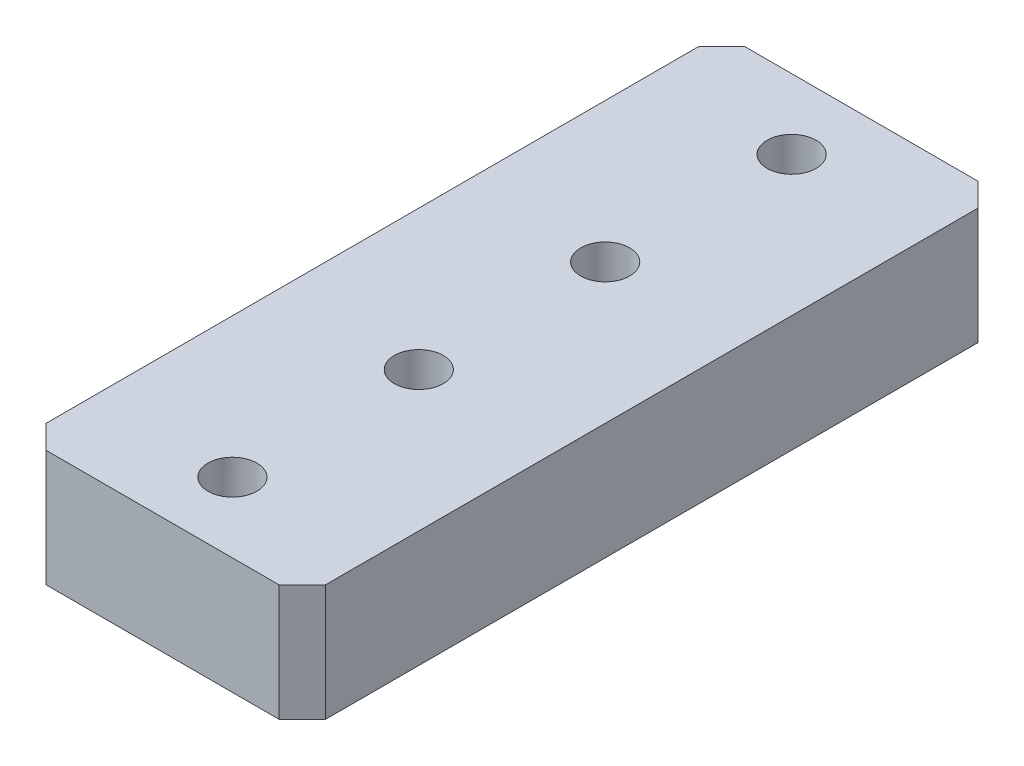
ISO-10303-21;
HEADER;
FILE_DESCRIPTION(('STEP AP214'),'2;1');
FILE_NAME('part.step','',(''),(''),'','','');
FILE_SCHEMA(('AUTOMOTIVE_DESIGN { 1 0 10303 214 1 1 1 1 }'));
ENDSEC;
DATA;
#1=APPLICATION_CONTEXT('core data for automotive mechanical design processes');
#2=APPLICATION_PROTOCOL_DEFINITION('international standard','automotive_design',2000,#1);
#3=PRODUCT_CONTEXT('',#1,'mechanical');
#4=PRODUCT('Part','Part','',(#3));
#5=PRODUCT_RELATED_PRODUCT_CATEGORY('part','',(#4));
#6=PRODUCT_DEFINITION_FORMATION('','',#4);
#7=PRODUCT_DEFINITION_CONTEXT('part definition',#1,'design');
#8=PRODUCT_DEFINITION('design','',#6,#7);
#9=PRODUCT_DEFINITION_SHAPE('','',#8);
#10=(LENGTH_UNIT() NAMED_UNIT(*) SI_UNIT(.MILLI.,.METRE.));
#11=(NAMED_UNIT(*) PLANE_ANGLE_UNIT() SI_UNIT($,.RADIAN.));
#12=(NAMED_UNIT(*) SI_UNIT($,.STERADIAN.) SOLID_ANGLE_UNIT());
#13=UNCERTAINTY_MEASURE_WITH_UNIT(LENGTH_MEASURE(1.E-05),#10,'distance_accuracy_value','');
#14=(GEOMETRIC_REPRESENTATION_CONTEXT(3) GLOBAL_UNCERTAINTY_ASSIGNED_CONTEXT((#13)) GLOBAL_UNIT_ASSIGNED_CONTEXT((#10,
#11,#12)) REPRESENTATION_CONTEXT('',''));
#15=CARTESIAN_POINT('',(0.,0.,0.));
#16=DIRECTION('',(0.,0.,1.));
#17=DIRECTION('',(1.,0.,0.));
#18=AXIS2_PLACEMENT_3D('',#15,#16,#17);
#19=CARTESIAN_POINT('',(0.,-5.,8.));
#20=DIRECTION('',(0.,1.,0.));
#21=DIRECTION('',(0.,0.,1.));
#22=AXIS2_PLACEMENT_3D('',#19,#20,#21);
#23=CYLINDRICAL_SURFACE('',#22,2.1);
#24=CARTESIAN_POINT('',(0.,10.,8.));
#25=DIRECTION('',(0.,1.,0.));
#26=DIRECTION('',(0.,0.,1.));
#27=AXIS2_PLACEMENT_3D('',#24,#25,#26);
#28=CIRCLE('',#27,2.1);
#29=CARTESIAN_POINT('',(0.,10.,10.1));
#30=VERTEX_POINT('',#29);
#31=EDGE_CURVE('E192',#30,#30,#28,.T.);
#32=ORIENTED_EDGE('',*,*,#31,.T.);
#33=EDGE_LOOP('',(#32));
#34=FACE_BOUND('',#33,.T.);
#35=CARTESIAN_POINT('',(0.,6.,8.));
#36=DIRECTION('',(0.,-1.,0.));
#37=DIRECTION('',(0.,0.,-1.));
#38=AXIS2_PLACEMENT_3D('',#35,#36,#37);
#39=CIRCLE('',#38,2.1);
#40=CARTESIAN_POINT('',(0.,6.,5.9));
#41=VERTEX_POINT('',#40);
#42=EDGE_CURVE('E48',#41,#41,#39,.F.);
#43=ORIENTED_EDGE('',*,*,#42,.F.);
#44=EDGE_LOOP('',(#43));
#45=FACE_BOUND('',#44,.T.);
#46=ADVANCED_FACE('F43',(#34,#45),#23,.F.);
#47=CARTESIAN_POINT('',(0.,-5.,-8.));
#48=DIRECTION('',(0.,1.,0.));
#49=DIRECTION('',(0.,0.,1.));
#50=AXIS2_PLACEMENT_3D('',#47,#48,#49);
#51=CYLINDRICAL_SURFACE('',#50,2.1);
#52=CARTESIAN_POINT('',(0.,10.,-8.));
#53=DIRECTION('',(0.,1.,0.));
#54=DIRECTION('',(0.,0.,1.));
#55=AXIS2_PLACEMENT_3D('',#52,#53,#54);
#56=CIRCLE('',#55,2.1);
#57=CARTESIAN_POINT('',(0.,10.,-5.9));
#58=VERTEX_POINT('',#57);
#59=EDGE_CURVE('E188',#58,#58,#56,.T.);
#60=ORIENTED_EDGE('',*,*,#59,.T.);
#61=EDGE_LOOP('',(#60));
#62=FACE_BOUND('',#61,.T.);
#63=CARTESIAN_POINT('',(0.,6.,-8.));
#64=DIRECTION('',(0.,-1.,0.));
#65=DIRECTION('',(0.,0.,-1.));
#66=AXIS2_PLACEMENT_3D('',#63,#64,#65);
#67=CIRCLE('',#66,2.1);
#68=CARTESIAN_POINT('',(0.,6.,-10.1));
#69=VERTEX_POINT('',#68);
#70=EDGE_CURVE('E174',#69,#69,#67,.F.);
#71=ORIENTED_EDGE('',*,*,#70,.F.);
#72=EDGE_LOOP('',(#71));
#73=FACE_BOUND('',#72,.T.);
#74=ADVANCED_FACE('F227',(#62,#73),#51,.F.);
#75=CARTESIAN_POINT('',(0.,-5.,24.));
#76=DIRECTION('',(0.,1.,0.));
#77=DIRECTION('',(0.,0.,1.));
#78=AXIS2_PLACEMENT_3D('',#75,#76,#77);
#79=CYLINDRICAL_SURFACE('',#78,2.1);
#80=CARTESIAN_POINT('',(0.,10.,24.));
#81=DIRECTION('',(0.,1.,0.));
#82=DIRECTION('',(0.,0.,1.));
#83=AXIS2_PLACEMENT_3D('',#80,#81,#82);
#84=CIRCLE('',#83,2.1);
#85=CARTESIAN_POINT('',(0.,10.,26.1));
#86=VERTEX_POINT('',#85);
#87=EDGE_CURVE('E183',#86,#86,#84,.T.);
#88=ORIENTED_EDGE('',*,*,#87,.T.);
#89=EDGE_LOOP('',(#88));
#90=FACE_BOUND('',#89,.T.);
#91=CARTESIAN_POINT('',(0.,6.,24.));
#92=DIRECTION('',(0.,-1.,0.));
#93=DIRECTION('',(0.,0.,-1.));
#94=AXIS2_PLACEMENT_3D('',#91,#92,#93);
#95=CIRCLE('',#94,2.1);
#96=CARTESIAN_POINT('',(0.,6.,21.9));
#97=VERTEX_POINT('',#96);
#98=EDGE_CURVE('E171',#97,#97,#95,.F.);
#99=ORIENTED_EDGE('',*,*,#98,.F.);
#100=EDGE_LOOP('',(#99));
#101=FACE_BOUND('',#100,.T.);
#102=ADVANCED_FACE('F234',(#90,#101),#79,.F.);
#103=CARTESIAN_POINT('',(0.,-5.,-24.));
#104=DIRECTION('',(0.,1.,0.));
#105=DIRECTION('',(0.,0.,1.));
#106=AXIS2_PLACEMENT_3D('',#103,#104,#105);
#107=CYLINDRICAL_SURFACE('',#106,2.1);
#108=CARTESIAN_POINT('',(0.,10.,-24.));
#109=DIRECTION('',(0.,1.,0.));
#110=DIRECTION('',(0.,0.,1.));
#111=AXIS2_PLACEMENT_3D('',#108,#109,#110);
#112=CIRCLE('',#111,2.1);
#113=CARTESIAN_POINT('',(0.,10.,-21.9));
#114=VERTEX_POINT('',#113);
#115=EDGE_CURVE('E179',#114,#114,#112,.T.);
#116=ORIENTED_EDGE('',*,*,#115,.T.);
#117=EDGE_LOOP('',(#116));
#118=FACE_BOUND('',#117,.T.);
#119=CARTESIAN_POINT('',(0.,6.,-24.));
#120=DIRECTION('',(0.,-1.,0.));
#121=DIRECTION('',(0.,0.,-1.));
#122=AXIS2_PLACEMENT_3D('',#119,#120,#121);
#123=CIRCLE('',#122,2.1);
#124=CARTESIAN_POINT('',(0.,6.,-26.1));
#125=VERTEX_POINT('',#124);
#126=EDGE_CURVE('E168',#125,#125,#123,.F.);
#127=ORIENTED_EDGE('',*,*,#126,.F.);
#128=EDGE_LOOP('',(#127));
#129=FACE_BOUND('',#128,.T.);
#130=ADVANCED_FACE('F224',(#118,#129),#107,.F.);
#131=CARTESIAN_POINT('',(12.,10.,-30.));
#132=DIRECTION('',(-1.,0.,0.));
#133=DIRECTION('',(0.,0.,1.));
#134=AXIS2_PLACEMENT_3D('',#131,#132,#133);
#135=PLANE('',#134);
#136=DIRECTION('',(0.,0.,-1.));
#137=VECTOR('',#136,1.);
#138=CARTESIAN_POINT('',(12.,0.,-30.));
#139=LINE('',#138,#137);
#140=CARTESIAN_POINT('',(12.,0.,28.));
#141=VERTEX_POINT('',#140);
#142=CARTESIAN_POINT('',(12.,0.,-28.));
#143=VERTEX_POINT('',#142);
#144=EDGE_CURVE('E141',#141,#143,#139,.T.);
#145=ORIENTED_EDGE('',*,*,#144,.T.);
#146=DIRECTION('',(0.,1.,0.));
#147=VECTOR('',#146,1.);
#148=CARTESIAN_POINT('',(12.,10.,-28.));
#149=LINE('',#148,#147);
#150=CARTESIAN_POINT('',(12.,10.,-28.));
#151=VERTEX_POINT('',#150);
#152=EDGE_CURVE('E164',#143,#151,#149,.T.);
#153=ORIENTED_EDGE('',*,*,#152,.T.);
#154=DIRECTION('',(0.,0.,-1.));
#155=VECTOR('',#154,1.);
#156=CARTESIAN_POINT('',(12.,10.,-30.));
#157=LINE('',#156,#155);
#158=CARTESIAN_POINT('',(12.,10.,28.));
#159=VERTEX_POINT('',#158);
#160=EDGE_CURVE('E139',#159,#151,#157,.T.);
#161=ORIENTED_EDGE('',*,*,#160,.F.);
#162=DIRECTION('',(0.,-1.,0.));
#163=VECTOR('',#162,1.);
#164=CARTESIAN_POINT('',(12.,10.,28.));
#165=LINE('',#164,#163);
#166=EDGE_CURVE('E161',#159,#141,#165,.T.);
#167=ORIENTED_EDGE('',*,*,#166,.T.);
#168=EDGE_LOOP('',(#145,#153,#161,#167));
#169=FACE_BOUND('',#168,.T.);
#170=ADVANCED_FACE('F205',(#169),#135,.F.);
#171=CARTESIAN_POINT('',(-12.,10.,-30.));
#172=DIRECTION('',(0.,0.,1.));
#173=DIRECTION('',(1.,0.,0.));
#174=AXIS2_PLACEMENT_3D('',#171,#172,#173);
#175=PLANE('',#174);
#176=DIRECTION('',(-1.,0.,0.));
#177=VECTOR('',#176,1.);
#178=CARTESIAN_POINT('',(-12.,0.,-30.));
#179=LINE('',#178,#177);
#180=CARTESIAN_POINT('',(10.,0.,-30.));
#181=VERTEX_POINT('',#180);
#182=CARTESIAN_POINT('',(-10.,0.,-30.));
#183=VERTEX_POINT('',#182);
#184=EDGE_CURVE('E137',#181,#183,#179,.T.);
#185=ORIENTED_EDGE('',*,*,#184,.T.);
#186=DIRECTION('',(0.,1.,0.));
#187=VECTOR('',#186,1.);
#188=CARTESIAN_POINT('',(-10.,10.,-30.));
#189=LINE('',#188,#187);
#190=CARTESIAN_POINT('',(-10.,10.,-30.));
#191=VERTEX_POINT('',#190);
#192=EDGE_CURVE('E116',#183,#191,#189,.T.);
#193=ORIENTED_EDGE('',*,*,#192,.T.);
#194=DIRECTION('',(-1.,0.,0.));
#195=VECTOR('',#194,1.);
#196=CARTESIAN_POINT('',(-12.,10.,-30.));
#197=LINE('',#196,#195);
#198=CARTESIAN_POINT('',(10.,10.,-30.));
#199=VERTEX_POINT('',#198);
#200=EDGE_CURVE('E197',#199,#191,#197,.T.);
#201=ORIENTED_EDGE('',*,*,#200,.F.);
#202=DIRECTION('',(0.,-1.,0.));
#203=VECTOR('',#202,1.);
#204=CARTESIAN_POINT('',(10.,10.,-30.));
#205=LINE('',#204,#203);
#206=EDGE_CURVE('E121',#199,#181,#205,.T.);
#207=ORIENTED_EDGE('',*,*,#206,.T.);
#208=EDGE_LOOP('',(#185,#193,#201,#207));
#209=FACE_BOUND('',#208,.T.);
#210=ADVANCED_FACE('F215',(#209),#175,.F.);
#211=CARTESIAN_POINT('',(-12.,10.,-30.));
#212=DIRECTION('',(1.,0.,0.));
#213=DIRECTION('',(0.,0.,-1.));
#214=AXIS2_PLACEMENT_3D('',#211,#212,#213);
#215=PLANE('',#214);
#216=DIRECTION('',(0.,0.,1.));
#217=VECTOR('',#216,1.);
#218=CARTESIAN_POINT('',(-12.,10.,-30.));
#219=LINE('',#218,#217);
#220=CARTESIAN_POINT('',(-12.,10.,-28.));
#221=VERTEX_POINT('',#220);
#222=CARTESIAN_POINT('',(-12.,10.,28.));
#223=VERTEX_POINT('',#222);
#224=EDGE_CURVE('E130',#221,#223,#219,.T.);
#225=ORIENTED_EDGE('',*,*,#224,.F.);
#226=DIRECTION('',(0.,-1.,0.));
#227=VECTOR('',#226,1.);
#228=CARTESIAN_POINT('',(-12.,10.,-28.));
#229=LINE('',#228,#227);
#230=CARTESIAN_POINT('',(-12.,0.,-28.));
#231=VERTEX_POINT('',#230);
#232=EDGE_CURVE('E115',#221,#231,#229,.T.);
#233=ORIENTED_EDGE('',*,*,#232,.T.);
#234=DIRECTION('',(0.,0.,1.));
#235=VECTOR('',#234,1.);
#236=CARTESIAN_POINT('',(-12.,0.,-30.));
#237=LINE('',#236,#235);
#238=CARTESIAN_POINT('',(-12.,0.,28.));
#239=VERTEX_POINT('',#238);
#240=EDGE_CURVE('E128',#231,#239,#237,.T.);
#241=ORIENTED_EDGE('',*,*,#240,.T.);
#242=DIRECTION('',(0.,1.,0.));
#243=VECTOR('',#242,1.);
#244=CARTESIAN_POINT('',(-12.,10.,28.));
#245=LINE('',#244,#243);
#246=EDGE_CURVE('E132',#239,#223,#245,.T.);
#247=ORIENTED_EDGE('',*,*,#246,.T.);
#248=EDGE_LOOP('',(#225,#233,#241,#247));
#249=FACE_BOUND('',#248,.T.);
#250=ADVANCED_FACE('F127',(#249),#215,.F.);
#251=CARTESIAN_POINT('',(-12.,10.,30.));
#252=DIRECTION('',(0.,0.,-1.));
#253=DIRECTION('',(-1.,0.,0.));
#254=AXIS2_PLACEMENT_3D('',#251,#252,#253);
#255=PLANE('',#254);
#256=DIRECTION('',(1.,0.,0.));
#257=VECTOR('',#256,1.);
#258=CARTESIAN_POINT('',(-12.,0.,30.));
#259=LINE('',#258,#257);
#260=CARTESIAN_POINT('',(-10.,0.,30.));
#261=VERTEX_POINT('',#260);
#262=CARTESIAN_POINT('',(10.,0.,30.));
#263=VERTEX_POINT('',#262);
#264=EDGE_CURVE('E136',#261,#263,#259,.T.);
#265=ORIENTED_EDGE('',*,*,#264,.T.);
#266=DIRECTION('',(0.,1.,0.));
#267=VECTOR('',#266,1.);
#268=CARTESIAN_POINT('',(10.,10.,30.));
#269=LINE('',#268,#267);
#270=CARTESIAN_POINT('',(10.,10.,30.));
#271=VERTEX_POINT('',#270);
#272=EDGE_CURVE('E11',#263,#271,#269,.T.);
#273=ORIENTED_EDGE('',*,*,#272,.T.);
#274=DIRECTION('',(1.,0.,0.));
#275=VECTOR('',#274,1.);
#276=CARTESIAN_POINT('',(-12.,10.,30.));
#277=LINE('',#276,#275);
#278=CARTESIAN_POINT('',(-10.,10.,30.));
#279=VERTEX_POINT('',#278);
#280=EDGE_CURVE('E145',#279,#271,#277,.T.);
#281=ORIENTED_EDGE('',*,*,#280,.F.);
#282=DIRECTION('',(0.,-1.,0.));
#283=VECTOR('',#282,1.);
#284=CARTESIAN_POINT('',(-10.,10.,30.));
#285=LINE('',#284,#283);
#286=EDGE_CURVE('E53',#279,#261,#285,.T.);
#287=ORIENTED_EDGE('',*,*,#286,.T.);
#288=EDGE_LOOP('',(#265,#273,#281,#287));
#289=FACE_BOUND('',#288,.T.);
#290=ADVANCED_FACE('F222',(#289),#255,.F.);
#291=CARTESIAN_POINT('',(0.,10.,0.));
#292=DIRECTION('',(0.,1.,0.));
#293=DIRECTION('',(0.,0.,1.));
#294=AXIS2_PLACEMENT_3D('',#291,#292,#293);
#295=PLANE('',#294);
#296=ORIENTED_EDGE('',*,*,#115,.F.);
#297=EDGE_LOOP('',(#296));
#298=FACE_BOUND('',#297,.T.);
#299=ORIENTED_EDGE('',*,*,#87,.F.);
#300=EDGE_LOOP('',(#299));
#301=FACE_BOUND('',#300,.T.);
#302=ORIENTED_EDGE('',*,*,#59,.F.);
#303=EDGE_LOOP('',(#302));
#304=FACE_BOUND('',#303,.T.);
#305=ORIENTED_EDGE('',*,*,#31,.F.);
#306=EDGE_LOOP('',(#305));
#307=FACE_BOUND('',#306,.T.);
#308=ORIENTED_EDGE('',*,*,#200,.T.);
#309=DIRECTION('',(0.707106781186549,0.,-0.707106781186546));
#310=VECTOR('',#309,1.);
#311=CARTESIAN_POINT('',(-20.,10.,-20.0000000000001));
#312=LINE('',#311,#310);
#313=EDGE_CURVE('E159',#191,#221,#312,.F.);
#314=ORIENTED_EDGE('',*,*,#313,.T.);
#315=ORIENTED_EDGE('',*,*,#224,.T.);
#316=DIRECTION('',(-0.707106781186546,0.,-0.707106781186549));
#317=VECTOR('',#316,1.);
#318=CARTESIAN_POINT('',(-20.,10.,19.9999999999999));
#319=LINE('',#318,#317);
#320=EDGE_CURVE('E66',#223,#279,#319,.F.);
#321=ORIENTED_EDGE('',*,*,#320,.T.);
#322=ORIENTED_EDGE('',*,*,#280,.T.);
#323=DIRECTION('',(-0.707106781186549,0.,0.707106781186546));
#324=VECTOR('',#323,1.);
#325=CARTESIAN_POINT('',(20.,10.,20.0000000000001));
#326=LINE('',#325,#324);
#327=EDGE_CURVE('E155',#271,#159,#326,.F.);
#328=ORIENTED_EDGE('',*,*,#327,.T.);
#329=ORIENTED_EDGE('',*,*,#160,.T.);
#330=DIRECTION('',(0.707106781186546,0.,0.707106781186549));
#331=VECTOR('',#330,1.);
#332=CARTESIAN_POINT('',(20.,10.,-20.));
#333=LINE('',#332,#331);
#334=EDGE_CURVE('E157',#151,#199,#333,.F.);
#335=ORIENTED_EDGE('',*,*,#334,.T.);
#336=EDGE_LOOP('',(#308,#314,#315,#321,#322,#328,#329,#335));
#337=FACE_BOUND('',#336,.T.);
#338=ADVANCED_FACE('F213',(#298,#301,#304,#307,#337),#295,.T.);
#339=CARTESIAN_POINT('',(0.,0.,0.));
#340=DIRECTION('',(0.,1.,0.));
#341=DIRECTION('',(0.,0.,1.));
#342=AXIS2_PLACEMENT_3D('',#339,#340,#341);
#343=PLANE('',#342);
#344=CARTESIAN_POINT('',(0.,0.,-24.));
#345=DIRECTION('',(0.,-1.,0.));
#346=DIRECTION('',(0.,0.,-1.));
#347=AXIS2_PLACEMENT_3D('',#344,#345,#346);
#348=CIRCLE('',#347,5.);
#349=CARTESIAN_POINT('',(0.,0.,-29.));
#350=VERTEX_POINT('',#349);
#351=EDGE_CURVE('E431',#350,#350,#348,.T.);
#352=ORIENTED_EDGE('',*,*,#351,.F.);
#353=EDGE_LOOP('',(#352));
#354=FACE_BOUND('',#353,.T.);
#355=CARTESIAN_POINT('',(0.,0.,-8.));
#356=DIRECTION('',(0.,-1.,0.));
#357=DIRECTION('',(0.,0.,-1.));
#358=AXIS2_PLACEMENT_3D('',#355,#356,#357);
#359=CIRCLE('',#358,5.);
#360=CARTESIAN_POINT('',(0.,0.,-13.));
#361=VERTEX_POINT('',#360);
#362=EDGE_CURVE('E406',#361,#361,#359,.T.);
#363=ORIENTED_EDGE('',*,*,#362,.F.);
#364=EDGE_LOOP('',(#363));
#365=FACE_BOUND('',#364,.T.);
#366=CARTESIAN_POINT('',(0.,0.,8.));
#367=DIRECTION('',(0.,-1.,0.));
#368=DIRECTION('',(0.,0.,-1.));
#369=AXIS2_PLACEMENT_3D('',#366,#367,#368);
#370=CIRCLE('',#369,5.);
#371=CARTESIAN_POINT('',(0.,0.,3.));
#372=VERTEX_POINT('',#371);
#373=EDGE_CURVE('E401',#372,#372,#370,.T.);
#374=ORIENTED_EDGE('',*,*,#373,.F.);
#375=EDGE_LOOP('',(#374));
#376=FACE_BOUND('',#375,.T.);
#377=CARTESIAN_POINT('',(0.,0.,24.));
#378=DIRECTION('',(0.,-1.,0.));
#379=DIRECTION('',(0.,0.,-1.));
#380=AXIS2_PLACEMENT_3D('',#377,#378,#379);
#381=CIRCLE('',#380,5.);
#382=CARTESIAN_POINT('',(0.,0.,19.));
#383=VERTEX_POINT('',#382);
#384=EDGE_CURVE('E408',#383,#383,#381,.T.);
#385=ORIENTED_EDGE('',*,*,#384,.F.);
#386=EDGE_LOOP('',(#385));
#387=FACE_BOUND('',#386,.T.);
#388=ORIENTED_EDGE('',*,*,#240,.F.);
#389=DIRECTION('',(-0.707106781186549,0.,0.707106781186546));
#390=VECTOR('',#389,1.);
#391=CARTESIAN_POINT('',(-12.,0.,-28.));
#392=LINE('',#391,#390);
#393=EDGE_CURVE('E111',#231,#183,#392,.F.);
#394=ORIENTED_EDGE('',*,*,#393,.T.);
#395=ORIENTED_EDGE('',*,*,#184,.F.);
#396=DIRECTION('',(-0.707106781186546,0.,-0.707106781186549));
#397=VECTOR('',#396,1.);
#398=CARTESIAN_POINT('',(10.,0.,-30.));
#399=LINE('',#398,#397);
#400=EDGE_CURVE('E122',#181,#143,#399,.F.);
#401=ORIENTED_EDGE('',*,*,#400,.T.);
#402=ORIENTED_EDGE('',*,*,#144,.F.);
#403=DIRECTION('',(0.707106781186549,0.,-0.707106781186546));
#404=VECTOR('',#403,1.);
#405=CARTESIAN_POINT('',(12.,0.,28.));
#406=LINE('',#405,#404);
#407=EDGE_CURVE('E148',#141,#263,#406,.F.);
#408=ORIENTED_EDGE('',*,*,#407,.T.);
#409=ORIENTED_EDGE('',*,*,#264,.F.);
#410=DIRECTION('',(0.707106781186546,0.,0.707106781186549));
#411=VECTOR('',#410,1.);
#412=CARTESIAN_POINT('',(-10.,0.,30.));
#413=LINE('',#412,#411);
#414=EDGE_CURVE('E131',#261,#239,#413,.F.);
#415=ORIENTED_EDGE('',*,*,#414,.T.);
#416=EDGE_LOOP('',(#388,#394,#395,#401,#402,#408,#409,#415));
#417=FACE_BOUND('',#416,.T.);
#418=ADVANCED_FACE('F134',(#354,#365,#376,#387,#417),#343,.F.);
#419=CARTESIAN_POINT('',(-12.,10.,-28.));
#420=DIRECTION('',(0.707106781186546,0.,0.707106781186549));
#421=DIRECTION('',(0.,-1.,0.));
#422=AXIS2_PLACEMENT_3D('',#419,#420,#421);
#423=PLANE('',#422);
#424=ORIENTED_EDGE('',*,*,#313,.F.);
#425=ORIENTED_EDGE('',*,*,#192,.F.);
#426=ORIENTED_EDGE('',*,*,#393,.F.);
#427=ORIENTED_EDGE('',*,*,#232,.F.);
#428=EDGE_LOOP('',(#424,#425,#426,#427));
#429=FACE_BOUND('',#428,.T.);
#430=ADVANCED_FACE('F114',(#429),#423,.F.);
#431=CARTESIAN_POINT('',(10.,10.,-30.));
#432=DIRECTION('',(-0.707106781186549,0.,0.707106781186546));
#433=DIRECTION('',(0.,-1.,0.));
#434=AXIS2_PLACEMENT_3D('',#431,#432,#433);
#435=PLANE('',#434);
#436=ORIENTED_EDGE('',*,*,#334,.F.);
#437=ORIENTED_EDGE('',*,*,#152,.F.);
#438=ORIENTED_EDGE('',*,*,#400,.F.);
#439=ORIENTED_EDGE('',*,*,#206,.F.);
#440=EDGE_LOOP('',(#436,#437,#438,#439));
#441=FACE_BOUND('',#440,.T.);
#442=ADVANCED_FACE('F210',(#441),#435,.F.);
#443=CARTESIAN_POINT('',(12.,10.,28.));
#444=DIRECTION('',(-0.707106781186546,0.,-0.707106781186549));
#445=DIRECTION('',(0.,-1.,0.));
#446=AXIS2_PLACEMENT_3D('',#443,#444,#445);
#447=PLANE('',#446);
#448=ORIENTED_EDGE('',*,*,#327,.F.);
#449=ORIENTED_EDGE('',*,*,#272,.F.);
#450=ORIENTED_EDGE('',*,*,#407,.F.);
#451=ORIENTED_EDGE('',*,*,#166,.F.);
#452=EDGE_LOOP('',(#448,#449,#450,#451));
#453=FACE_BOUND('',#452,.T.);
#454=ADVANCED_FACE('F253',(#453),#447,.F.);
#455=CARTESIAN_POINT('',(-10.,10.,30.));
#456=DIRECTION('',(0.707106781186549,0.,-0.707106781186546));
#457=DIRECTION('',(0.,-1.,0.));
#458=AXIS2_PLACEMENT_3D('',#455,#456,#457);
#459=PLANE('',#458);
#460=ORIENTED_EDGE('',*,*,#320,.F.);
#461=ORIENTED_EDGE('',*,*,#246,.F.);
#462=ORIENTED_EDGE('',*,*,#414,.F.);
#463=ORIENTED_EDGE('',*,*,#286,.F.);
#464=EDGE_LOOP('',(#460,#461,#462,#463));
#465=FACE_BOUND('',#464,.T.);
#466=ADVANCED_FACE('F46',(#465),#459,.F.);
#467=CARTESIAN_POINT('',(0.,6.,-24.));
#468=DIRECTION('',(0.,-1.,0.));
#469=DIRECTION('',(0.,0.,-1.));
#470=AXIS2_PLACEMENT_3D('',#467,#468,#469);
#471=PLANE('',#470);
#472=CARTESIAN_POINT('',(0.,6.,-24.));
#473=DIRECTION('',(0.,-1.,0.));
#474=DIRECTION('',(0.,0.,-1.));
#475=AXIS2_PLACEMENT_3D('',#472,#473,#474);
#476=CIRCLE('',#475,5.);
#477=CARTESIAN_POINT('',(0.,6.,-29.));
#478=VERTEX_POINT('',#477);
#479=EDGE_CURVE('E172',#478,#478,#476,.T.);
#480=ORIENTED_EDGE('',*,*,#479,.T.);
#481=EDGE_LOOP('',(#480));
#482=FACE_BOUND('',#481,.T.);
#483=ORIENTED_EDGE('',*,*,#126,.T.);
#484=EDGE_LOOP('',(#483));
#485=FACE_BOUND('',#484,.T.);
#486=ADVANCED_FACE('F256',(#482,#485),#471,.T.);
#487=CARTESIAN_POINT('',(0.,6.,-24.));
#488=DIRECTION('',(0.,-1.,0.));
#489=DIRECTION('',(0.,0.,-1.));
#490=AXIS2_PLACEMENT_3D('',#487,#488,#489);
#491=CYLINDRICAL_SURFACE('',#490,5.);
#492=ORIENTED_EDGE('',*,*,#479,.F.);
#493=EDGE_LOOP('',(#492));
#494=FACE_BOUND('',#493,.T.);
#495=ORIENTED_EDGE('',*,*,#351,.T.);
#496=EDGE_LOOP('',(#495));
#497=FACE_BOUND('',#496,.T.);
#498=ADVANCED_FACE('F261',(#494,#497),#491,.F.);
#499=CARTESIAN_POINT('',(0.,6.,24.));
#500=DIRECTION('',(0.,-1.,0.));
#501=DIRECTION('',(0.,0.,-1.));
#502=AXIS2_PLACEMENT_3D('',#499,#500,#501);
#503=PLANE('',#502);
#504=CARTESIAN_POINT('',(0.,6.,24.));
#505=DIRECTION('',(0.,-1.,0.));
#506=DIRECTION('',(0.,0.,-1.));
#507=AXIS2_PLACEMENT_3D('',#504,#505,#506);
#508=CIRCLE('',#507,5.);
#509=CARTESIAN_POINT('',(0.,6.,19.));
#510=VERTEX_POINT('',#509);
#511=EDGE_CURVE('E414',#510,#510,#508,.T.);
#512=ORIENTED_EDGE('',*,*,#511,.T.);
#513=EDGE_LOOP('',(#512));
#514=FACE_BOUND('',#513,.T.);
#515=ORIENTED_EDGE('',*,*,#98,.T.);
#516=EDGE_LOOP('',(#515));
#517=FACE_BOUND('',#516,.T.);
#518=ADVANCED_FACE('F332',(#514,#517),#503,.T.);
#519=CARTESIAN_POINT('',(0.,6.,24.));
#520=DIRECTION('',(0.,-1.,0.));
#521=DIRECTION('',(0.,0.,-1.));
#522=AXIS2_PLACEMENT_3D('',#519,#520,#521);
#523=CYLINDRICAL_SURFACE('',#522,5.);
#524=ORIENTED_EDGE('',*,*,#511,.F.);
#525=EDGE_LOOP('',(#524));
#526=FACE_BOUND('',#525,.T.);
#527=ORIENTED_EDGE('',*,*,#384,.T.);
#528=EDGE_LOOP('',(#527));
#529=FACE_BOUND('',#528,.T.);
#530=ADVANCED_FACE('F342',(#526,#529),#523,.F.);
#531=CARTESIAN_POINT('',(0.,6.,-8.));
#532=DIRECTION('',(0.,-1.,0.));
#533=DIRECTION('',(0.,0.,-1.));
#534=AXIS2_PLACEMENT_3D('',#531,#532,#533);
#535=PLANE('',#534);
#536=CARTESIAN_POINT('',(0.,6.,-8.));
#537=DIRECTION('',(0.,-1.,0.));
#538=DIRECTION('',(0.,0.,-1.));
#539=AXIS2_PLACEMENT_3D('',#536,#537,#538);
#540=CIRCLE('',#539,5.);
#541=CARTESIAN_POINT('',(0.,6.,-13.));
#542=VERTEX_POINT('',#541);
#543=EDGE_CURVE('E403',#542,#542,#540,.T.);
#544=ORIENTED_EDGE('',*,*,#543,.T.);
#545=EDGE_LOOP('',(#544));
#546=FACE_BOUND('',#545,.T.);
#547=ORIENTED_EDGE('',*,*,#70,.T.);
#548=EDGE_LOOP('',(#547));
#549=FACE_BOUND('',#548,.T.);
#550=ADVANCED_FACE('F352',(#546,#549),#535,.T.);
#551=CARTESIAN_POINT('',(0.,6.,-8.));
#552=DIRECTION('',(0.,-1.,0.));
#553=DIRECTION('',(0.,0.,-1.));
#554=AXIS2_PLACEMENT_3D('',#551,#552,#553);
#555=CYLINDRICAL_SURFACE('',#554,5.);
#556=ORIENTED_EDGE('',*,*,#543,.F.);
#557=EDGE_LOOP('',(#556));
#558=FACE_BOUND('',#557,.T.);
#559=ORIENTED_EDGE('',*,*,#362,.T.);
#560=EDGE_LOOP('',(#559));
#561=FACE_BOUND('',#560,.T.);
#562=ADVANCED_FACE('F362',(#558,#561),#555,.F.);
#563=CARTESIAN_POINT('',(0.,6.,8.));
#564=DIRECTION('',(0.,-1.,0.));
#565=DIRECTION('',(0.,0.,-1.));
#566=AXIS2_PLACEMENT_3D('',#563,#564,#565);
#567=PLANE('',#566);
#568=CARTESIAN_POINT('',(0.,6.,8.));
#569=DIRECTION('',(0.,-1.,0.));
#570=DIRECTION('',(0.,0.,-1.));
#571=AXIS2_PLACEMENT_3D('',#568,#569,#570);
#572=CIRCLE('',#571,5.);
#573=CARTESIAN_POINT('',(0.,6.,3.));
#574=VERTEX_POINT('',#573);
#575=EDGE_CURVE('E398',#574,#574,#572,.T.);
#576=ORIENTED_EDGE('',*,*,#575,.T.);
#577=EDGE_LOOP('',(#576));
#578=FACE_BOUND('',#577,.T.);
#579=ORIENTED_EDGE('',*,*,#42,.T.);
#580=EDGE_LOOP('',(#579));
#581=FACE_BOUND('',#580,.T.);
#582=ADVANCED_FACE('F372',(#578,#581),#567,.T.);
#583=CARTESIAN_POINT('',(0.,6.,8.));
#584=DIRECTION('',(0.,-1.,0.));
#585=DIRECTION('',(0.,0.,-1.));
#586=AXIS2_PLACEMENT_3D('',#583,#584,#585);
#587=CYLINDRICAL_SURFACE('',#586,5.);
#588=ORIENTED_EDGE('',*,*,#575,.F.);
#589=EDGE_LOOP('',(#588));
#590=FACE_BOUND('',#589,.T.);
#591=ORIENTED_EDGE('',*,*,#373,.T.);
#592=EDGE_LOOP('',(#591));
#593=FACE_BOUND('',#592,.T.);
#594=ADVANCED_FACE('F382',(#590,#593),#587,.F.);
#595=CLOSED_SHELL('',(#46,#74,#102,#130,#170,#210,#250,#290,#338,#418,#430,#442,#454,#466,#486,
#498,#518,#530,#550,#562,#582,#594));
#596=MANIFOLD_SOLID_BREP('B2',#595);
#597=ADVANCED_BREP_SHAPE_REPRESENTATION('',(#18,#596),#14);
#598=SHAPE_DEFINITION_REPRESENTATION(#9,#597);
ENDSEC;
END-ISO-10303-21;
